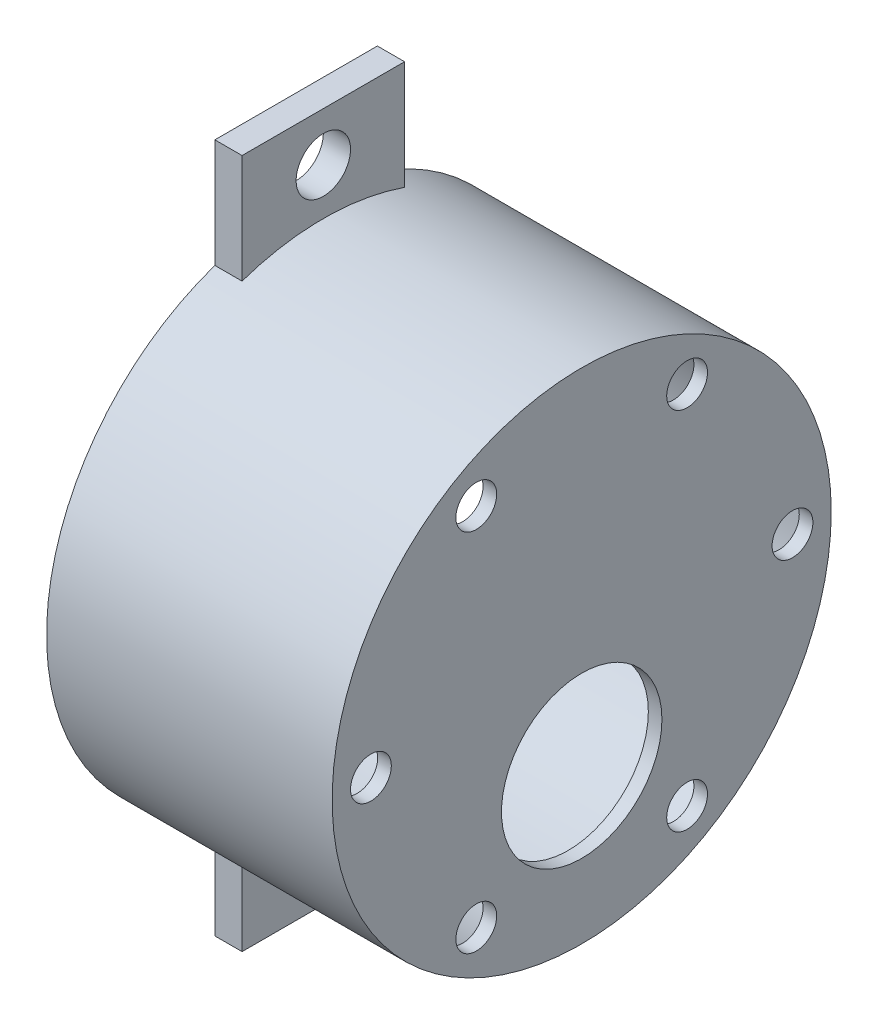
ISO-10303-21;
HEADER;
FILE_DESCRIPTION(('STEP AP214'),'2;1');
FILE_NAME('part.step','',(''),(''),'','','');
FILE_SCHEMA(('AUTOMOTIVE_DESIGN { 1 0 10303 214 1 1 1 1 }'));
ENDSEC;
DATA;
#1=APPLICATION_CONTEXT('core data for automotive mechanical design processes');
#2=APPLICATION_PROTOCOL_DEFINITION('international standard','automotive_design',2000,#1);
#3=PRODUCT_CONTEXT('',#1,'mechanical');
#4=PRODUCT('Part','Part','',(#3));
#5=PRODUCT_RELATED_PRODUCT_CATEGORY('part','',(#4));
#6=PRODUCT_DEFINITION_FORMATION('','',#4);
#7=PRODUCT_DEFINITION_CONTEXT('part definition',#1,'design');
#8=PRODUCT_DEFINITION('design','',#6,#7);
#9=PRODUCT_DEFINITION_SHAPE('','',#8);
#10=(LENGTH_UNIT() NAMED_UNIT(*) SI_UNIT(.MILLI.,.METRE.));
#11=(NAMED_UNIT(*) PLANE_ANGLE_UNIT() SI_UNIT($,.RADIAN.));
#12=(NAMED_UNIT(*) SI_UNIT($,.STERADIAN.) SOLID_ANGLE_UNIT());
#13=UNCERTAINTY_MEASURE_WITH_UNIT(LENGTH_MEASURE(1.E-05),#10,'distance_accuracy_value','');
#14=(GEOMETRIC_REPRESENTATION_CONTEXT(3) GLOBAL_UNCERTAINTY_ASSIGNED_CONTEXT((#13)) GLOBAL_UNIT_ASSIGNED_CONTEXT((#10,
#11,#12)) REPRESENTATION_CONTEXT('',''));
#15=CARTESIAN_POINT('',(0.,0.,0.));
#16=DIRECTION('',(0.,0.,1.));
#17=DIRECTION('',(1.,0.,0.));
#18=AXIS2_PLACEMENT_3D('',#15,#16,#17);
#19=CARTESIAN_POINT('',(-21.,0.,0.));
#20=DIRECTION('',(1.,0.,0.));
#21=DIRECTION('',(0.,0.,-1.));
#22=AXIS2_PLACEMENT_3D('',#19,#20,#21);
#23=CYLINDRICAL_SURFACE('',#22,18.35);
#24=CARTESIAN_POINT('',(0.,0.,0.));
#25=DIRECTION('',(1.,0.,0.));
#26=DIRECTION('',(0.,0.,-1.));
#27=AXIS2_PLACEMENT_3D('',#24,#25,#26);
#28=CIRCLE('',#27,18.35);
#29=CARTESIAN_POINT('',(0.,0.,-18.35));
#30=VERTEX_POINT('',#29);
#31=EDGE_CURVE('E271',#30,#30,#28,.T.);
#32=ORIENTED_EDGE('',*,*,#31,.F.);
#33=EDGE_LOOP('',(#32));
#34=FACE_BOUND('',#33,.T.);
#35=CARTESIAN_POINT('',(-19.,0.,0.));
#36=DIRECTION('',(1.,0.,0.));
#37=DIRECTION('',(0.,0.,-1.));
#38=AXIS2_PLACEMENT_3D('',#35,#36,#37);
#39=CIRCLE('',#38,18.35);
#40=CARTESIAN_POINT('',(-19.,-17.35,-5.97494769851587));
#41=VERTEX_POINT('',#40);
#42=CARTESIAN_POINT('',(-19.,-17.35,5.97494769851586));
#43=VERTEX_POINT('',#42);
#44=EDGE_CURVE('E67',#41,#43,#39,.F.);
#45=ORIENTED_EDGE('',*,*,#44,.F.);
#46=DIRECTION('',(-1.,0.,0.));
#47=VECTOR('',#46,1.);
#48=CARTESIAN_POINT('',(-19.,-17.35,-5.97494769851586));
#49=LINE('',#48,#47);
#50=CARTESIAN_POINT('',(-21.,-17.35,-5.97494769851586));
#51=VERTEX_POINT('',#50);
#52=EDGE_CURVE('E136',#41,#51,#49,.T.);
#53=ORIENTED_EDGE('',*,*,#52,.T.);
#54=CARTESIAN_POINT('',(-21.,0.,0.));
#55=DIRECTION('',(1.,0.,0.));
#56=DIRECTION('',(0.,0.,-1.));
#57=AXIS2_PLACEMENT_3D('',#54,#55,#56);
#58=CIRCLE('',#57,18.35);
#59=CARTESIAN_POINT('',(-21.,17.35,-5.97494769851587));
#60=VERTEX_POINT('',#59);
#61=EDGE_CURVE('E56',#51,#60,#58,.T.);
#62=ORIENTED_EDGE('',*,*,#61,.T.);
#63=DIRECTION('',(-1.,0.,0.));
#64=VECTOR('',#63,1.);
#65=CARTESIAN_POINT('',(-19.,17.35,-5.97494769851586));
#66=LINE('',#65,#64);
#67=CARTESIAN_POINT('',(-19.,17.35,-5.97494769851587));
#68=VERTEX_POINT('',#67);
#69=EDGE_CURVE('E184',#68,#60,#66,.T.);
#70=ORIENTED_EDGE('',*,*,#69,.F.);
#71=CARTESIAN_POINT('',(-19.,0.,0.));
#72=DIRECTION('',(1.,0.,0.));
#73=DIRECTION('',(0.,0.,-1.));
#74=AXIS2_PLACEMENT_3D('',#71,#72,#73);
#75=CIRCLE('',#74,18.35);
#76=CARTESIAN_POINT('',(-19.,17.35,5.97494769851586));
#77=VERTEX_POINT('',#76);
#78=EDGE_CURVE('E198',#77,#68,#75,.F.);
#79=ORIENTED_EDGE('',*,*,#78,.F.);
#80=DIRECTION('',(-1.,0.,0.));
#81=VECTOR('',#80,1.);
#82=CARTESIAN_POINT('',(-19.,17.35,5.97494769851586));
#83=LINE('',#82,#81);
#84=CARTESIAN_POINT('',(-21.,17.35,5.97494769851586));
#85=VERTEX_POINT('',#84);
#86=EDGE_CURVE('E202',#77,#85,#83,.T.);
#87=ORIENTED_EDGE('',*,*,#86,.T.);
#88=CARTESIAN_POINT('',(-21.,-17.35,5.97494769851586));
#89=VERTEX_POINT('',#88);
#90=EDGE_CURVE('E11',#85,#89,#58,.T.);
#91=ORIENTED_EDGE('',*,*,#90,.T.);
#92=DIRECTION('',(-1.,0.,0.));
#93=VECTOR('',#92,1.);
#94=CARTESIAN_POINT('',(-19.,-17.35,5.97494769851586));
#95=LINE('',#94,#93);
#96=EDGE_CURVE('E63',#43,#89,#95,.T.);
#97=ORIENTED_EDGE('',*,*,#96,.F.);
#98=EDGE_LOOP('',(#45,#53,#62,#70,#79,#87,#91,#97));
#99=FACE_BOUND('',#98,.T.);
#100=ADVANCED_FACE('F47',(#34,#99),#23,.T.);
#101=CARTESIAN_POINT('',(-21.,0.,0.));
#102=DIRECTION('',(1.,0.,0.));
#103=DIRECTION('',(0.,0.,-1.));
#104=AXIS2_PLACEMENT_3D('',#101,#102,#103);
#105=PLANE('',#104);
#106=CARTESIAN_POINT('',(-21.,-21.7639014947209,0.));
#107=DIRECTION('',(-1.,0.,0.));
#108=DIRECTION('',(0.,0.,-1.));
#109=AXIS2_PLACEMENT_3D('',#106,#107,#108);
#110=CIRCLE('',#109,2.);
#111=CARTESIAN_POINT('',(-21.,-21.7639014947209,-2.));
#112=VERTEX_POINT('',#111);
#113=EDGE_CURVE('E151',#112,#112,#110,.T.);
#114=ORIENTED_EDGE('',*,*,#113,.F.);
#115=EDGE_LOOP('',(#114));
#116=FACE_BOUND('',#115,.T.);
#117=CARTESIAN_POINT('',(-21.,0.,0.));
#118=DIRECTION('',(1.,0.,0.));
#119=DIRECTION('',(0.,0.,-1.));
#120=AXIS2_PLACEMENT_3D('',#117,#118,#119);
#121=CIRCLE('',#120,17.35);
#122=CARTESIAN_POINT('',(-21.,0.,-17.35));
#123=VERTEX_POINT('',#122);
#124=EDGE_CURVE('E268',#123,#123,#121,.T.);
#125=ORIENTED_EDGE('',*,*,#124,.T.);
#126=EDGE_LOOP('',(#125));
#127=FACE_BOUND('',#126,.T.);
#128=ORIENTED_EDGE('',*,*,#61,.F.);
#129=DIRECTION('',(0.,1.,0.));
#130=VECTOR('',#129,1.);
#131=CARTESIAN_POINT('',(-21.,-17.35,-5.97494769851586));
#132=LINE('',#131,#130);
#133=CARTESIAN_POINT('',(-21.,-25.35,-5.97494769851586));
#134=VERTEX_POINT('',#133);
#135=EDGE_CURVE('E148',#134,#51,#132,.T.);
#136=ORIENTED_EDGE('',*,*,#135,.F.);
#137=DIRECTION('',(0.,0.,-1.));
#138=VECTOR('',#137,1.);
#139=CARTESIAN_POINT('',(-21.,-25.35,-5.97494769851586));
#140=LINE('',#139,#138);
#141=CARTESIAN_POINT('',(-21.,-25.35,5.97494769851586));
#142=VERTEX_POINT('',#141);
#143=EDGE_CURVE('E128',#142,#134,#140,.T.);
#144=ORIENTED_EDGE('',*,*,#143,.F.);
#145=DIRECTION('',(0.,-1.,0.));
#146=VECTOR('',#145,1.);
#147=CARTESIAN_POINT('',(-21.,-17.35,5.97494769851586));
#148=LINE('',#147,#146);
#149=EDGE_CURVE('E138',#89,#142,#148,.T.);
#150=ORIENTED_EDGE('',*,*,#149,.F.);
#151=ORIENTED_EDGE('',*,*,#90,.F.);
#152=DIRECTION('',(0.,1.,0.));
#153=VECTOR('',#152,1.);
#154=CARTESIAN_POINT('',(-21.,17.35,5.97494769851586));
#155=LINE('',#154,#153);
#156=CARTESIAN_POINT('',(-21.,25.35,5.97494769851586));
#157=VERTEX_POINT('',#156);
#158=EDGE_CURVE('E188',#85,#157,#155,.T.);
#159=ORIENTED_EDGE('',*,*,#158,.T.);
#160=DIRECTION('',(0.,0.,-1.));
#161=VECTOR('',#160,1.);
#162=CARTESIAN_POINT('',(-21.,25.35,-5.97494769851586));
#163=LINE('',#162,#161);
#164=CARTESIAN_POINT('',(-21.,25.35,-5.97494769851586));
#165=VERTEX_POINT('',#164);
#166=EDGE_CURVE('E176',#157,#165,#163,.T.);
#167=ORIENTED_EDGE('',*,*,#166,.T.);
#168=DIRECTION('',(0.,-1.,0.));
#169=VECTOR('',#168,1.);
#170=CARTESIAN_POINT('',(-21.,17.35,-5.97494769851586));
#171=LINE('',#170,#169);
#172=EDGE_CURVE('E167',#165,#60,#171,.T.);
#173=ORIENTED_EDGE('',*,*,#172,.T.);
#174=EDGE_LOOP('',(#128,#136,#144,#150,#151,#159,#167,#173));
#175=FACE_BOUND('',#174,.T.);
#176=CARTESIAN_POINT('',(-21.,21.7639014947209,0.));
#177=DIRECTION('',(1.,0.,0.));
#178=DIRECTION('',(0.,0.,-1.));
#179=AXIS2_PLACEMENT_3D('',#176,#177,#178);
#180=CIRCLE('',#179,2.);
#181=CARTESIAN_POINT('',(-21.,21.7639014947209,-2.));
#182=VERTEX_POINT('',#181);
#183=EDGE_CURVE('E163',#182,#182,#180,.T.);
#184=ORIENTED_EDGE('',*,*,#183,.T.);
#185=EDGE_LOOP('',(#184));
#186=FACE_BOUND('',#185,.T.);
#187=ADVANCED_FACE('F282',(#116,#127,#175,#186),#105,.F.);
#188=CARTESIAN_POINT('',(0.,0.,0.));
#189=DIRECTION('',(1.,0.,0.));
#190=DIRECTION('',(0.,0.,-1.));
#191=AXIS2_PLACEMENT_3D('',#188,#189,#190);
#192=PLANE('',#191);
#193=CARTESIAN_POINT('',(0.,-7.00000000000003,0.));
#194=DIRECTION('',(1.,0.,0.));
#195=DIRECTION('',(0.,0.,-1.));
#196=AXIS2_PLACEMENT_3D('',#193,#194,#195);
#197=CIRCLE('',#196,5.9);
#198=CARTESIAN_POINT('',(0.,-7.00000000000003,-5.9));
#199=VERTEX_POINT('',#198);
#200=EDGE_CURVE('E212',#199,#199,#197,.T.);
#201=ORIENTED_EDGE('',*,*,#200,.F.);
#202=EDGE_LOOP('',(#201));
#203=FACE_BOUND('',#202,.T.);
#204=CARTESIAN_POINT('',(0.,0.,15.5));
#205=DIRECTION('',(1.,0.,0.));
#206=DIRECTION('',(0.,0.86602540378444,-0.499999999999998));
#207=AXIS2_PLACEMENT_3D('',#204,#205,#206);
#208=CIRCLE('',#207,1.5);
#209=CARTESIAN_POINT('',(0.,1.29903810567663,14.75));
#210=VERTEX_POINT('',#209);
#211=EDGE_CURVE('E216',#210,#210,#208,.T.);
#212=ORIENTED_EDGE('',*,*,#211,.F.);
#213=EDGE_LOOP('',(#212));
#214=FACE_BOUND('',#213,.T.);
#215=CARTESIAN_POINT('',(0.,-13.4233937586588,7.74999999999994));
#216=DIRECTION('',(1.,0.,0.));
#217=DIRECTION('',(0.,0.866025403784436,0.500000000000004));
#218=AXIS2_PLACEMENT_3D('',#215,#216,#217);
#219=CIRCLE('',#218,1.5);
#220=CARTESIAN_POINT('',(0.,-12.1243556529822,8.49999999999995));
#221=VERTEX_POINT('',#220);
#222=EDGE_CURVE('E226',#221,#221,#219,.T.);
#223=ORIENTED_EDGE('',*,*,#222,.F.);
#224=EDGE_LOOP('',(#223));
#225=FACE_BOUND('',#224,.T.);
#226=CARTESIAN_POINT('',(0.,-13.4233937586588,-7.75));
#227=DIRECTION('',(1.,0.,0.));
#228=DIRECTION('',(0.,0.,1.));
#229=AXIS2_PLACEMENT_3D('',#226,#227,#228);
#230=CIRCLE('',#229,1.5);
#231=CARTESIAN_POINT('',(0.,-13.4233937586588,-6.25));
#232=VERTEX_POINT('',#231);
#233=EDGE_CURVE('E234',#232,#232,#230,.T.);
#234=ORIENTED_EDGE('',*,*,#233,.F.);
#235=EDGE_LOOP('',(#234));
#236=FACE_BOUND('',#235,.T.);
#237=CARTESIAN_POINT('',(0.,1.4137996329211E-13,-15.5));
#238=DIRECTION('',(1.,0.,0.));
#239=DIRECTION('',(0.,-0.866025403784443,0.499999999999992));
#240=AXIS2_PLACEMENT_3D('',#237,#238,#239);
#241=CIRCLE('',#240,1.5);
#242=CARTESIAN_POINT('',(0.,-1.29903810567652,-14.75));
#243=VERTEX_POINT('',#242);
#244=EDGE_CURVE('E242',#243,#243,#241,.T.);
#245=ORIENTED_EDGE('',*,*,#244,.F.);
#246=EDGE_LOOP('',(#245));
#247=FACE_BOUND('',#246,.T.);
#248=CARTESIAN_POINT('',(0.,13.4233937586589,-7.74999999999984));
#249=DIRECTION('',(1.,0.,0.));
#250=DIRECTION('',(0.,-0.866025403784433,-0.50000000000001));
#251=AXIS2_PLACEMENT_3D('',#248,#249,#250);
#252=CIRCLE('',#251,1.5);
#253=CARTESIAN_POINT('',(0.,12.1243556529822,-8.49999999999986));
#254=VERTEX_POINT('',#253);
#255=EDGE_CURVE('E250',#254,#254,#252,.T.);
#256=ORIENTED_EDGE('',*,*,#255,.F.);
#257=EDGE_LOOP('',(#256));
#258=FACE_BOUND('',#257,.T.);
#259=CARTESIAN_POINT('',(0.,13.4233937586588,7.75));
#260=DIRECTION('',(1.,0.,0.));
#261=DIRECTION('',(0.,0.,-1.));
#262=AXIS2_PLACEMENT_3D('',#259,#260,#261);
#263=CIRCLE('',#262,1.5);
#264=CARTESIAN_POINT('',(0.,13.4233937586588,6.25));
#265=VERTEX_POINT('',#264);
#266=EDGE_CURVE('E225',#265,#265,#263,.T.);
#267=ORIENTED_EDGE('',*,*,#266,.F.);
#268=EDGE_LOOP('',(#267));
#269=FACE_BOUND('',#268,.T.);
#270=ORIENTED_EDGE('',*,*,#31,.T.);
#271=EDGE_LOOP('',(#270));
#272=FACE_BOUND('',#271,.T.);
#273=ADVANCED_FACE('F312',(#203,#214,#225,#236,#247,#258,#269,#272),#192,.T.);
#274=CARTESIAN_POINT('',(-21.,0.,0.));
#275=DIRECTION('',(1.,0.,0.));
#276=DIRECTION('',(0.,0.,-1.));
#277=AXIS2_PLACEMENT_3D('',#274,#275,#276);
#278=CYLINDRICAL_SURFACE('',#277,17.35);
#279=CARTESIAN_POINT('',(-1.,0.,0.));
#280=DIRECTION('',(1.,0.,0.));
#281=DIRECTION('',(0.,0.,-1.));
#282=AXIS2_PLACEMENT_3D('',#279,#280,#281);
#283=CIRCLE('',#282,17.35);
#284=CARTESIAN_POINT('',(-1.,0.,-17.35));
#285=VERTEX_POINT('',#284);
#286=EDGE_CURVE('E264',#285,#285,#283,.T.);
#287=CARTESIAN_POINT('',(-21.,0.,-17.35));
#288=CARTESIAN_POINT('',(-20.7916666666667,0.,-17.35));
#289=CARTESIAN_POINT('',(-20.5833333333333,0.,-17.35));
#290=CARTESIAN_POINT('',(-20.1666666666667,0.,-17.35));
#291=CARTESIAN_POINT('',(-19.9583333333333,0.,-17.35));
#292=CARTESIAN_POINT('',(-19.5416666666667,0.,-17.35));
#293=CARTESIAN_POINT('',(-19.3333333333333,0.,-17.35));
#294=CARTESIAN_POINT('',(-18.9166666666667,0.,-17.35));
#295=CARTESIAN_POINT('',(-18.7083333333333,0.,-17.35));
#296=CARTESIAN_POINT('',(-18.2916666666667,0.,-17.35));
#297=CARTESIAN_POINT('',(-18.0833333333333,0.,-17.35));
#298=CARTESIAN_POINT('',(-17.6666666666667,0.,-17.35));
#299=CARTESIAN_POINT('',(-17.4583333333333,0.,-17.35));
#300=CARTESIAN_POINT('',(-17.0416666666667,0.,-17.35));
#301=CARTESIAN_POINT('',(-16.8333333333333,0.,-17.35));
#302=CARTESIAN_POINT('',(-16.4166666666667,0.,-17.35));
#303=CARTESIAN_POINT('',(-16.2083333333333,0.,-17.35));
#304=CARTESIAN_POINT('',(-15.7916666666667,0.,-17.35));
#305=CARTESIAN_POINT('',(-15.5833333333333,0.,-17.35));
#306=CARTESIAN_POINT('',(-15.1666666666667,0.,-17.35));
#307=CARTESIAN_POINT('',(-14.9583333333333,0.,-17.35));
#308=CARTESIAN_POINT('',(-14.5416666666667,0.,-17.35));
#309=CARTESIAN_POINT('',(-14.3333333333333,0.,-17.35));
#310=CARTESIAN_POINT('',(-13.9166666666667,0.,-17.35));
#311=CARTESIAN_POINT('',(-13.7083333333333,0.,-17.35));
#312=CARTESIAN_POINT('',(-13.2916666666667,0.,-17.35));
#313=CARTESIAN_POINT('',(-13.0833333333333,0.,-17.35));
#314=CARTESIAN_POINT('',(-12.6666666666667,0.,-17.35));
#315=CARTESIAN_POINT('',(-12.4583333333333,0.,-17.35));
#316=CARTESIAN_POINT('',(-12.0416666666667,0.,-17.35));
#317=CARTESIAN_POINT('',(-11.8333333333333,0.,-17.35));
#318=CARTESIAN_POINT('',(-11.4166666666667,0.,-17.35));
#319=CARTESIAN_POINT('',(-11.2083333333333,0.,-17.35));
#320=CARTESIAN_POINT('',(-10.7916666666667,0.,-17.35));
#321=CARTESIAN_POINT('',(-10.5833333333333,0.,-17.35));
#322=CARTESIAN_POINT('',(-10.1666666666667,0.,-17.35));
#323=CARTESIAN_POINT('',(-9.95833333333333,0.,-17.35));
#324=CARTESIAN_POINT('',(-9.54166666666667,0.,-17.35));
#325=CARTESIAN_POINT('',(-9.33333333333333,0.,-17.35));
#326=CARTESIAN_POINT('',(-8.91666666666667,0.,-17.35));
#327=CARTESIAN_POINT('',(-8.70833333333333,0.,-17.35));
#328=CARTESIAN_POINT('',(-8.29166666666667,0.,-17.35));
#329=CARTESIAN_POINT('',(-8.08333333333333,0.,-17.35));
#330=CARTESIAN_POINT('',(-7.66666666666667,0.,-17.35));
#331=CARTESIAN_POINT('',(-7.45833333333333,0.,-17.35));
#332=CARTESIAN_POINT('',(-7.04166666666667,0.,-17.35));
#333=CARTESIAN_POINT('',(-6.83333333333333,0.,-17.35));
#334=CARTESIAN_POINT('',(-6.41666666666667,0.,-17.35));
#335=CARTESIAN_POINT('',(-6.20833333333333,0.,-17.35));
#336=CARTESIAN_POINT('',(-5.79166666666667,0.,-17.35));
#337=CARTESIAN_POINT('',(-5.58333333333333,0.,-17.35));
#338=CARTESIAN_POINT('',(-5.16666666666667,0.,-17.35));
#339=CARTESIAN_POINT('',(-4.95833333333333,0.,-17.35));
#340=CARTESIAN_POINT('',(-4.54166666666667,0.,-17.35));
#341=CARTESIAN_POINT('',(-4.33333333333334,0.,-17.35));
#342=CARTESIAN_POINT('',(-3.91666666666667,0.,-17.35));
#343=CARTESIAN_POINT('',(-3.70833333333334,0.,-17.35));
#344=CARTESIAN_POINT('',(-3.29166666666667,0.,-17.35));
#345=CARTESIAN_POINT('',(-3.08333333333334,0.,-17.35));
#346=CARTESIAN_POINT('',(-2.66666666666667,0.,-17.35));
#347=CARTESIAN_POINT('',(-2.45833333333334,0.,-17.35));
#348=CARTESIAN_POINT('',(-2.04166666666667,0.,-17.35));
#349=CARTESIAN_POINT('',(-1.83333333333333,0.,-17.35));
#350=CARTESIAN_POINT('',(-1.41666666666667,0.,-17.35));
#351=CARTESIAN_POINT('',(-1.20833333333333,0.,-17.35));
#352=CARTESIAN_POINT('',(-1.,0.,-17.35));
#353=B_SPLINE_CURVE_WITH_KNOTS('',3,(#287,#288,#289,#290,#291,#292,#293,#294,#295,#296,#297,
#298,#299,#300,#301,#302,#303,#304,#305,#306,#307,#308,#309,#310,#311,#312,#313,#314,#315,#316,
#317,#318,#319,#320,#321,#322,#323,#324,#325,#326,#327,#328,#329,#330,#331,#332,#333,#334,#335,
#336,#337,#338,#339,#340,#341,#342,#343,#344,#345,#346,#347,#348,#349,#350,#351,#352),
.UNSPECIFIED.,.F.,.F.,(4,2,2,2,2,2,2,2,2,2,2,2,2,2,2,2,2,2,2,2,2,2,2,2,2,2,2,2,2,2,2,2,4),(0.,
0.625000000000001,1.25,1.875,2.5,3.125,3.75,4.375,5.,5.625,6.25,6.875,7.5,8.125,8.75,9.375,10.,
10.625,11.25,11.875,12.5,13.125,13.75,14.375,15.,15.625,16.25,16.875,17.5,18.125,18.75,19.375,
20.),.UNSPECIFIED.);
#354=EDGE_CURVE('BSEAM319',#123,#285,#353,.T.);
#355=ORIENTED_EDGE('',*,*,#124,.F.);
#356=ORIENTED_EDGE('',*,*,#286,.T.);
#357=ORIENTED_EDGE('',*,*,#354,.T.);
#358=ORIENTED_EDGE('',*,*,#354,.F.);
#359=EDGE_LOOP('',(#355,#357,#356,#358));
#360=FACE_BOUND('',#359,.T.);
#361=ADVANCED_FACE('F319',(#360),#278,.F.);
#362=CARTESIAN_POINT('',(-1.,0.,0.));
#363=DIRECTION('',(1.,0.,0.));
#364=DIRECTION('',(0.,0.,-1.));
#365=AXIS2_PLACEMENT_3D('',#362,#363,#364);
#366=PLANE('',#365);
#367=CARTESIAN_POINT('',(-0.999999999999999,-7.00000000000003,0.));
#368=DIRECTION('',(1.,0.,0.));
#369=DIRECTION('',(0.,0.,-1.));
#370=AXIS2_PLACEMENT_3D('',#367,#368,#369);
#371=CIRCLE('',#370,5.9);
#372=CARTESIAN_POINT('',(-0.999999999999999,-7.00000000000003,-5.9));
#373=VERTEX_POINT('',#372);
#374=EDGE_CURVE('E50',#373,#373,#371,.T.);
#375=ORIENTED_EDGE('',*,*,#374,.T.);
#376=EDGE_LOOP('',(#375));
#377=FACE_BOUND('',#376,.T.);
#378=CARTESIAN_POINT('',(-1.,0.,15.5));
#379=DIRECTION('',(1.,0.,0.));
#380=DIRECTION('',(0.,0.,-1.));
#381=AXIS2_PLACEMENT_3D('',#378,#379,#380);
#382=CIRCLE('',#381,1.5);
#383=CARTESIAN_POINT('',(-1.,0.,14.));
#384=VERTEX_POINT('',#383);
#385=EDGE_CURVE('E220',#384,#384,#382,.F.);
#386=ORIENTED_EDGE('',*,*,#385,.F.);
#387=EDGE_LOOP('',(#386));
#388=FACE_BOUND('',#387,.T.);
#389=CARTESIAN_POINT('',(-1.,-13.4233937586588,7.74999999999994));
#390=DIRECTION('',(1.,0.,0.));
#391=DIRECTION('',(0.,0.,-1.));
#392=AXIS2_PLACEMENT_3D('',#389,#390,#391);
#393=CIRCLE('',#392,1.5);
#394=CARTESIAN_POINT('',(-1.,-13.4233937586588,6.24999999999994));
#395=VERTEX_POINT('',#394);
#396=EDGE_CURVE('E221',#395,#395,#393,.F.);
#397=ORIENTED_EDGE('',*,*,#396,.F.);
#398=EDGE_LOOP('',(#397));
#399=FACE_BOUND('',#398,.T.);
#400=CARTESIAN_POINT('',(-1.,-13.4233937586588,-7.75));
#401=DIRECTION('',(1.,0.,0.));
#402=DIRECTION('',(0.,0.,-1.));
#403=AXIS2_PLACEMENT_3D('',#400,#401,#402);
#404=CIRCLE('',#403,1.5);
#405=CARTESIAN_POINT('',(-1.,-13.4233937586588,-9.25));
#406=VERTEX_POINT('',#405);
#407=EDGE_CURVE('E230',#406,#406,#404,.F.);
#408=ORIENTED_EDGE('',*,*,#407,.F.);
#409=EDGE_LOOP('',(#408));
#410=FACE_BOUND('',#409,.T.);
#411=CARTESIAN_POINT('',(-1.,1.4137996329211E-13,-15.5));
#412=DIRECTION('',(1.,0.,0.));
#413=DIRECTION('',(0.,0.,-1.));
#414=AXIS2_PLACEMENT_3D('',#411,#412,#413);
#415=CIRCLE('',#414,1.5);
#416=CARTESIAN_POINT('',(-1.,1.4137996329211E-13,-17.));
#417=VERTEX_POINT('',#416);
#418=EDGE_CURVE('E238',#417,#417,#415,.F.);
#419=ORIENTED_EDGE('',*,*,#418,.F.);
#420=EDGE_LOOP('',(#419));
#421=FACE_BOUND('',#420,.T.);
#422=CARTESIAN_POINT('',(-1.,13.4233937586589,-7.74999999999984));
#423=DIRECTION('',(1.,0.,0.));
#424=DIRECTION('',(0.,0.,-1.));
#425=AXIS2_PLACEMENT_3D('',#422,#423,#424);
#426=CIRCLE('',#425,1.5);
#427=CARTESIAN_POINT('',(-1.,13.4233937586589,-9.24999999999984));
#428=VERTEX_POINT('',#427);
#429=EDGE_CURVE('E246',#428,#428,#426,.F.);
#430=ORIENTED_EDGE('',*,*,#429,.F.);
#431=EDGE_LOOP('',(#430));
#432=FACE_BOUND('',#431,.T.);
#433=CARTESIAN_POINT('',(-1.,13.4233937586588,7.75));
#434=DIRECTION('',(1.,0.,0.));
#435=DIRECTION('',(0.,0.,-1.));
#436=AXIS2_PLACEMENT_3D('',#433,#434,#435);
#437=CIRCLE('',#436,1.5);
#438=CARTESIAN_POINT('',(-1.,13.4233937586588,6.25));
#439=VERTEX_POINT('',#438);
#440=EDGE_CURVE('E260',#439,#439,#437,.F.);
#441=ORIENTED_EDGE('',*,*,#440,.F.);
#442=EDGE_LOOP('',(#441));
#443=FACE_BOUND('',#442,.T.);
#444=ORIENTED_EDGE('',*,*,#286,.F.);
#445=EDGE_LOOP('',(#444));
#446=FACE_BOUND('',#445,.T.);
#447=ADVANCED_FACE('F324',(#377,#388,#399,#410,#421,#432,#443,#446),#366,.F.);
#448=CARTESIAN_POINT('',(-5.24264068711928,13.4233937586588,7.75));
#449=DIRECTION('',(1.,0.,0.));
#450=DIRECTION('',(0.,0.,-1.));
#451=AXIS2_PLACEMENT_3D('',#448,#449,#450);
#452=CYLINDRICAL_SURFACE('',#451,1.5);
#453=ORIENTED_EDGE('',*,*,#440,.T.);
#454=EDGE_LOOP('',(#453));
#455=FACE_BOUND('',#454,.T.);
#456=ORIENTED_EDGE('',*,*,#266,.T.);
#457=EDGE_LOOP('',(#456));
#458=FACE_BOUND('',#457,.T.);
#459=ADVANCED_FACE('F327',(#455,#458),#452,.F.);
#460=CARTESIAN_POINT('',(-5.24264068711928,13.4233937586589,-7.74999999999984));
#461=DIRECTION('',(1.,0.,0.));
#462=DIRECTION('',(0.,0.,-1.));
#463=AXIS2_PLACEMENT_3D('',#460,#461,#462);
#464=CYLINDRICAL_SURFACE('',#463,1.5);
#465=ORIENTED_EDGE('',*,*,#429,.T.);
#466=EDGE_LOOP('',(#465));
#467=FACE_BOUND('',#466,.T.);
#468=ORIENTED_EDGE('',*,*,#255,.T.);
#469=EDGE_LOOP('',(#468));
#470=FACE_BOUND('',#469,.T.);
#471=ADVANCED_FACE('F333',(#467,#470),#464,.F.);
#472=CARTESIAN_POINT('',(-5.24264068711928,1.4137996329211E-13,-15.5));
#473=DIRECTION('',(1.,0.,0.));
#474=DIRECTION('',(0.,0.,-1.));
#475=AXIS2_PLACEMENT_3D('',#472,#473,#474);
#476=CYLINDRICAL_SURFACE('',#475,1.5);
#477=ORIENTED_EDGE('',*,*,#418,.T.);
#478=EDGE_LOOP('',(#477));
#479=FACE_BOUND('',#478,.T.);
#480=ORIENTED_EDGE('',*,*,#244,.T.);
#481=EDGE_LOOP('',(#480));
#482=FACE_BOUND('',#481,.T.);
#483=ADVANCED_FACE('F337',(#479,#482),#476,.F.);
#484=CARTESIAN_POINT('',(-5.24264068711928,-13.4233937586588,-7.75));
#485=DIRECTION('',(1.,0.,0.));
#486=DIRECTION('',(0.,0.,-1.));
#487=AXIS2_PLACEMENT_3D('',#484,#485,#486);
#488=CYLINDRICAL_SURFACE('',#487,1.5);
#489=ORIENTED_EDGE('',*,*,#407,.T.);
#490=EDGE_LOOP('',(#489));
#491=FACE_BOUND('',#490,.T.);
#492=ORIENTED_EDGE('',*,*,#233,.T.);
#493=EDGE_LOOP('',(#492));
#494=FACE_BOUND('',#493,.T.);
#495=ADVANCED_FACE('F341',(#491,#494),#488,.F.);
#496=CARTESIAN_POINT('',(-5.24264068711928,-13.4233937586588,7.74999999999994));
#497=DIRECTION('',(1.,0.,0.));
#498=DIRECTION('',(0.,0.,-1.));
#499=AXIS2_PLACEMENT_3D('',#496,#497,#498);
#500=CYLINDRICAL_SURFACE('',#499,1.5);
#501=ORIENTED_EDGE('',*,*,#396,.T.);
#502=EDGE_LOOP('',(#501));
#503=FACE_BOUND('',#502,.T.);
#504=ORIENTED_EDGE('',*,*,#222,.T.);
#505=EDGE_LOOP('',(#504));
#506=FACE_BOUND('',#505,.T.);
#507=ADVANCED_FACE('F345',(#503,#506),#500,.F.);
#508=CARTESIAN_POINT('',(-5.24264068711928,0.,15.5));
#509=DIRECTION('',(1.,0.,0.));
#510=DIRECTION('',(0.,0.,-1.));
#511=AXIS2_PLACEMENT_3D('',#508,#509,#510);
#512=CYLINDRICAL_SURFACE('',#511,1.5);
#513=ORIENTED_EDGE('',*,*,#385,.T.);
#514=EDGE_LOOP('',(#513));
#515=FACE_BOUND('',#514,.T.);
#516=ORIENTED_EDGE('',*,*,#211,.T.);
#517=EDGE_LOOP('',(#516));
#518=FACE_BOUND('',#517,.T.);
#519=ADVANCED_FACE('F349',(#515,#518),#512,.F.);
#520=CARTESIAN_POINT('',(-10.,-7.00000000000003,0.));
#521=DIRECTION('',(1.,0.,0.));
#522=DIRECTION('',(0.,0.,-1.));
#523=AXIS2_PLACEMENT_3D('',#520,#521,#522);
#524=CYLINDRICAL_SURFACE('',#523,5.9);
#525=ORIENTED_EDGE('',*,*,#200,.T.);
#526=EDGE_LOOP('',(#525));
#527=FACE_BOUND('',#526,.T.);
#528=ORIENTED_EDGE('',*,*,#374,.F.);
#529=EDGE_LOOP('',(#528));
#530=FACE_BOUND('',#529,.T.);
#531=ADVANCED_FACE('F353',(#527,#530),#524,.F.);
#532=CARTESIAN_POINT('',(-19.,17.35,-5.97494769851586));
#533=DIRECTION('',(0.,0.,-1.));
#534=DIRECTION('',(-1.,0.,0.));
#535=AXIS2_PLACEMENT_3D('',#532,#533,#534);
#536=PLANE('',#535);
#537=ORIENTED_EDGE('',*,*,#172,.F.);
#538=DIRECTION('',(-1.,0.,0.));
#539=VECTOR('',#538,1.);
#540=CARTESIAN_POINT('',(-19.,25.35,-5.97494769851586));
#541=LINE('',#540,#539);
#542=CARTESIAN_POINT('',(-19.,25.35,-5.97494769851586));
#543=VERTEX_POINT('',#542);
#544=EDGE_CURVE('E195',#543,#165,#541,.T.);
#545=ORIENTED_EDGE('',*,*,#544,.F.);
#546=DIRECTION('',(0.,-1.,0.));
#547=VECTOR('',#546,1.);
#548=CARTESIAN_POINT('',(-19.,17.35,-5.97494769851586));
#549=LINE('',#548,#547);
#550=EDGE_CURVE('E171',#543,#68,#549,.T.);
#551=ORIENTED_EDGE('',*,*,#550,.T.);
#552=ORIENTED_EDGE('',*,*,#69,.T.);
#553=EDGE_LOOP('',(#537,#545,#551,#552));
#554=FACE_BOUND('',#553,.T.);
#555=ADVANCED_FACE('F280',(#554),#536,.T.);
#556=CARTESIAN_POINT('',(-19.,25.35,-5.97494769851586));
#557=DIRECTION('',(0.,1.,0.));
#558=DIRECTION('',(0.,0.,1.));
#559=AXIS2_PLACEMENT_3D('',#556,#557,#558);
#560=PLANE('',#559);
#561=ORIENTED_EDGE('',*,*,#166,.F.);
#562=DIRECTION('',(-1.,0.,0.));
#563=VECTOR('',#562,1.);
#564=CARTESIAN_POINT('',(-19.,25.35,5.97494769851586));
#565=LINE('',#564,#563);
#566=CARTESIAN_POINT('',(-19.,25.35,5.97494769851586));
#567=VERTEX_POINT('',#566);
#568=EDGE_CURVE('E199',#567,#157,#565,.T.);
#569=ORIENTED_EDGE('',*,*,#568,.F.);
#570=DIRECTION('',(0.,0.,-1.));
#571=VECTOR('',#570,1.);
#572=CARTESIAN_POINT('',(-19.,25.35,-5.97494769851586));
#573=LINE('',#572,#571);
#574=EDGE_CURVE('E180',#567,#543,#573,.T.);
#575=ORIENTED_EDGE('',*,*,#574,.T.);
#576=ORIENTED_EDGE('',*,*,#544,.T.);
#577=EDGE_LOOP('',(#561,#569,#575,#576));
#578=FACE_BOUND('',#577,.T.);
#579=ADVANCED_FACE('F287',(#578),#560,.T.);
#580=CARTESIAN_POINT('',(-19.,17.35,5.97494769851586));
#581=DIRECTION('',(0.,0.,1.));
#582=DIRECTION('',(1.,0.,0.));
#583=AXIS2_PLACEMENT_3D('',#580,#581,#582);
#584=PLANE('',#583);
#585=ORIENTED_EDGE('',*,*,#158,.F.);
#586=ORIENTED_EDGE('',*,*,#86,.F.);
#587=DIRECTION('',(0.,1.,0.));
#588=VECTOR('',#587,1.);
#589=CARTESIAN_POINT('',(-19.,17.35,5.97494769851586));
#590=LINE('',#589,#588);
#591=EDGE_CURVE('E175',#77,#567,#590,.T.);
#592=ORIENTED_EDGE('',*,*,#591,.T.);
#593=ORIENTED_EDGE('',*,*,#568,.T.);
#594=EDGE_LOOP('',(#585,#586,#592,#593));
#595=FACE_BOUND('',#594,.T.);
#596=ADVANCED_FACE('F294',(#595),#584,.T.);
#597=CARTESIAN_POINT('',(-19.,0.,0.));
#598=DIRECTION('',(1.,0.,0.));
#599=DIRECTION('',(0.,0.,-1.));
#600=AXIS2_PLACEMENT_3D('',#597,#598,#599);
#601=PLANE('',#600);
#602=CARTESIAN_POINT('',(-19.,21.7639014947209,0.));
#603=DIRECTION('',(1.,0.,0.));
#604=DIRECTION('',(0.,0.,-1.));
#605=AXIS2_PLACEMENT_3D('',#602,#603,#604);
#606=CIRCLE('',#605,2.);
#607=CARTESIAN_POINT('',(-19.,21.7639014947209,-2.));
#608=VERTEX_POINT('',#607);
#609=EDGE_CURVE('E162',#608,#608,#606,.T.);
#610=ORIENTED_EDGE('',*,*,#609,.F.);
#611=EDGE_LOOP('',(#610));
#612=FACE_BOUND('',#611,.T.);
#613=ORIENTED_EDGE('',*,*,#591,.F.);
#614=ORIENTED_EDGE('',*,*,#78,.T.);
#615=ORIENTED_EDGE('',*,*,#550,.F.);
#616=ORIENTED_EDGE('',*,*,#574,.F.);
#617=EDGE_LOOP('',(#613,#614,#615,#616));
#618=FACE_BOUND('',#617,.T.);
#619=ADVANCED_FACE('F291',(#612,#618),#601,.T.);
#620=CARTESIAN_POINT('',(-21.,21.7639014947209,0.));
#621=DIRECTION('',(1.,0.,0.));
#622=DIRECTION('',(0.,0.,-1.));
#623=AXIS2_PLACEMENT_3D('',#620,#621,#622);
#624=CYLINDRICAL_SURFACE('',#623,2.);
#625=ORIENTED_EDGE('',*,*,#183,.F.);
#626=EDGE_LOOP('',(#625));
#627=FACE_BOUND('',#626,.T.);
#628=ORIENTED_EDGE('',*,*,#609,.T.);
#629=EDGE_LOOP('',(#628));
#630=FACE_BOUND('',#629,.T.);
#631=ADVANCED_FACE('F301',(#627,#630),#624,.F.);
#632=CARTESIAN_POINT('',(-19.,-17.35,-5.97494769851586));
#633=DIRECTION('',(0.,0.,1.));
#634=DIRECTION('',(1.,0.,0.));
#635=AXIS2_PLACEMENT_3D('',#632,#633,#634);
#636=PLANE('',#635);
#637=ORIENTED_EDGE('',*,*,#135,.T.);
#638=ORIENTED_EDGE('',*,*,#52,.F.);
#639=DIRECTION('',(0.,1.,0.));
#640=VECTOR('',#639,1.);
#641=CARTESIAN_POINT('',(-19.,-17.35,-5.97494769851586));
#642=LINE('',#641,#640);
#643=CARTESIAN_POINT('',(-19.,-25.35,-5.97494769851586));
#644=VERTEX_POINT('',#643);
#645=EDGE_CURVE('E115',#644,#41,#642,.T.);
#646=ORIENTED_EDGE('',*,*,#645,.F.);
#647=DIRECTION('',(-1.,0.,0.));
#648=VECTOR('',#647,1.);
#649=CARTESIAN_POINT('',(-19.,-25.35,-5.97494769851586));
#650=LINE('',#649,#648);
#651=EDGE_CURVE('E125',#644,#134,#650,.T.);
#652=ORIENTED_EDGE('',*,*,#651,.T.);
#653=EDGE_LOOP('',(#637,#638,#646,#652));
#654=FACE_BOUND('',#653,.T.);
#655=ADVANCED_FACE('F135',(#654),#636,.F.);
#656=CARTESIAN_POINT('',(-19.,-17.35,5.97494769851586));
#657=DIRECTION('',(0.,0.,-1.));
#658=DIRECTION('',(-1.,0.,0.));
#659=AXIS2_PLACEMENT_3D('',#656,#657,#658);
#660=PLANE('',#659);
#661=ORIENTED_EDGE('',*,*,#149,.T.);
#662=DIRECTION('',(-1.,0.,0.));
#663=VECTOR('',#662,1.);
#664=CARTESIAN_POINT('',(-19.,-25.35,5.97494769851586));
#665=LINE('',#664,#663);
#666=CARTESIAN_POINT('',(-19.,-25.35,5.97494769851586));
#667=VERTEX_POINT('',#666);
#668=EDGE_CURVE('E133',#667,#142,#665,.T.);
#669=ORIENTED_EDGE('',*,*,#668,.F.);
#670=DIRECTION('',(0.,-1.,0.));
#671=VECTOR('',#670,1.);
#672=CARTESIAN_POINT('',(-19.,-17.35,5.97494769851586));
#673=LINE('',#672,#671);
#674=EDGE_CURVE('E118',#43,#667,#673,.T.);
#675=ORIENTED_EDGE('',*,*,#674,.F.);
#676=ORIENTED_EDGE('',*,*,#96,.T.);
#677=EDGE_LOOP('',(#661,#669,#675,#676));
#678=FACE_BOUND('',#677,.T.);
#679=ADVANCED_FACE('F405',(#678),#660,.F.);
#680=CARTESIAN_POINT('',(-19.,-25.35,-5.97494769851586));
#681=DIRECTION('',(0.,1.,0.));
#682=DIRECTION('',(0.,0.,1.));
#683=AXIS2_PLACEMENT_3D('',#680,#681,#682);
#684=PLANE('',#683);
#685=ORIENTED_EDGE('',*,*,#143,.T.);
#686=ORIENTED_EDGE('',*,*,#651,.F.);
#687=DIRECTION('',(0.,0.,-1.));
#688=VECTOR('',#687,1.);
#689=CARTESIAN_POINT('',(-19.,-25.35,-5.97494769851586));
#690=LINE('',#689,#688);
#691=EDGE_CURVE('E111',#667,#644,#690,.T.);
#692=ORIENTED_EDGE('',*,*,#691,.F.);
#693=ORIENTED_EDGE('',*,*,#668,.T.);
#694=EDGE_LOOP('',(#685,#686,#692,#693));
#695=FACE_BOUND('',#694,.T.);
#696=ADVANCED_FACE('F126',(#695),#684,.F.);
#697=CARTESIAN_POINT('',(-19.,0.,0.));
#698=DIRECTION('',(1.,0.,0.));
#699=DIRECTION('',(0.,0.,-1.));
#700=AXIS2_PLACEMENT_3D('',#697,#698,#699);
#701=PLANE('',#700);
#702=CARTESIAN_POINT('',(-19.,-21.7639014947209,0.));
#703=DIRECTION('',(-1.,0.,0.));
#704=DIRECTION('',(0.,0.,-1.));
#705=AXIS2_PLACEMENT_3D('',#702,#703,#704);
#706=CIRCLE('',#705,2.);
#707=CARTESIAN_POINT('',(-19.,-21.7639014947209,-2.));
#708=VERTEX_POINT('',#707);
#709=EDGE_CURVE('E143',#708,#708,#706,.T.);
#710=ORIENTED_EDGE('',*,*,#709,.T.);
#711=EDGE_LOOP('',(#710));
#712=FACE_BOUND('',#711,.T.);
#713=ORIENTED_EDGE('',*,*,#645,.T.);
#714=ORIENTED_EDGE('',*,*,#44,.T.);
#715=ORIENTED_EDGE('',*,*,#674,.T.);
#716=ORIENTED_EDGE('',*,*,#691,.T.);
#717=EDGE_LOOP('',(#713,#714,#715,#716));
#718=FACE_BOUND('',#717,.T.);
#719=ADVANCED_FACE('F113',(#712,#718),#701,.T.);
#720=CARTESIAN_POINT('',(-21.,-21.7639014947209,0.));
#721=DIRECTION('',(1.,0.,0.));
#722=DIRECTION('',(0.,0.,-1.));
#723=AXIS2_PLACEMENT_3D('',#720,#721,#722);
#724=CYLINDRICAL_SURFACE('',#723,2.);
#725=ORIENTED_EDGE('',*,*,#113,.T.);
#726=EDGE_LOOP('',(#725));
#727=FACE_BOUND('',#726,.T.);
#728=ORIENTED_EDGE('',*,*,#709,.F.);
#729=EDGE_LOOP('',(#728));
#730=FACE_BOUND('',#729,.T.);
#731=ADVANCED_FACE('F431',(#727,#730),#724,.F.);
#732=CLOSED_SHELL('',(#100,#187,#273,#361,#447,#459,#471,#483,#495,#507,#519,#531,#555,#579,
#596,#619,#631,#655,#679,#696,#719,#731));
#733=MANIFOLD_SOLID_BREP('B2',#732);
#734=ADVANCED_BREP_SHAPE_REPRESENTATION('',(#18,#733),#14);
#735=SHAPE_DEFINITION_REPRESENTATION(#9,#734);
ENDSEC;
END-ISO-10303-21;
